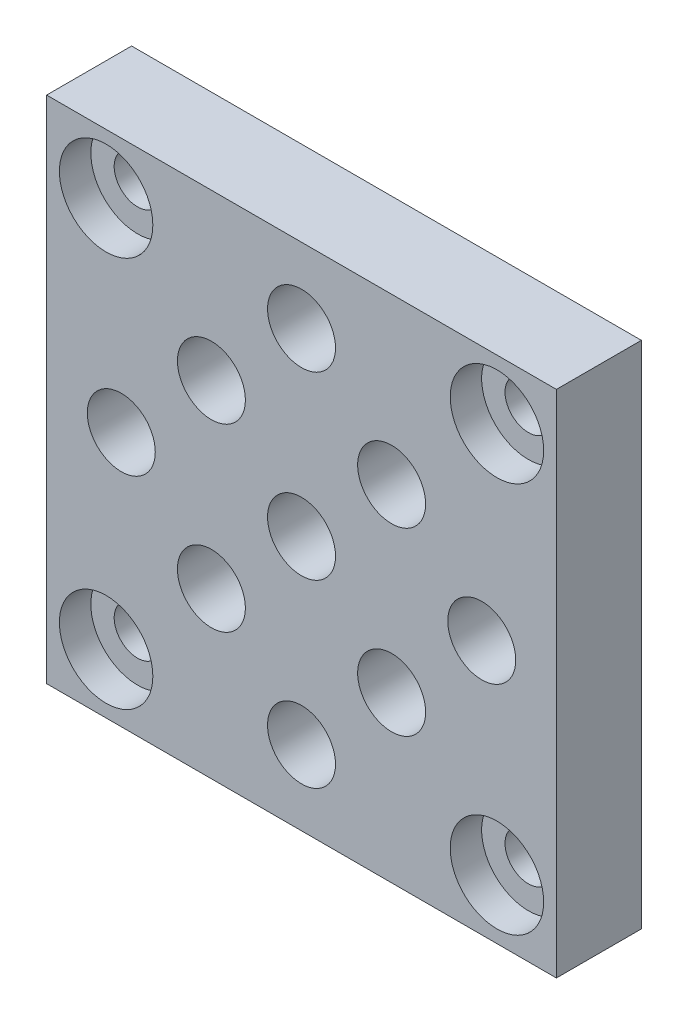
ISO-10303-21;
HEADER;
FILE_DESCRIPTION(('STEP AP214'),'2;1');
FILE_NAME('part.step','',(''),(''),'','','');
FILE_SCHEMA(('AUTOMOTIVE_DESIGN { 1 0 10303 214 1 1 1 1 }'));
ENDSEC;
DATA;
#1=APPLICATION_CONTEXT('core data for automotive mechanical design processes');
#2=APPLICATION_PROTOCOL_DEFINITION('international standard','automotive_design',2000,#1);
#3=PRODUCT_CONTEXT('',#1,'mechanical');
#4=PRODUCT('Part','Part','',(#3));
#5=PRODUCT_RELATED_PRODUCT_CATEGORY('part','',(#4));
#6=PRODUCT_DEFINITION_FORMATION('','',#4);
#7=PRODUCT_DEFINITION_CONTEXT('part definition',#1,'design');
#8=PRODUCT_DEFINITION('design','',#6,#7);
#9=PRODUCT_DEFINITION_SHAPE('','',#8);
#10=(LENGTH_UNIT() NAMED_UNIT(*) SI_UNIT(.MILLI.,.METRE.));
#11=(NAMED_UNIT(*) PLANE_ANGLE_UNIT() SI_UNIT($,.RADIAN.));
#12=(NAMED_UNIT(*) SI_UNIT($,.STERADIAN.) SOLID_ANGLE_UNIT());
#13=UNCERTAINTY_MEASURE_WITH_UNIT(LENGTH_MEASURE(1.E-05),#10,'distance_accuracy_value','');
#14=(GEOMETRIC_REPRESENTATION_CONTEXT(3) GLOBAL_UNCERTAINTY_ASSIGNED_CONTEXT((#13)) GLOBAL_UNIT_ASSIGNED_CONTEXT((#10,
#11,#12)) REPRESENTATION_CONTEXT('',''));
#15=CARTESIAN_POINT('',(0.,0.,0.));
#16=DIRECTION('',(0.,0.,1.));
#17=DIRECTION('',(1.,0.,0.));
#18=AXIS2_PLACEMENT_3D('',#15,#16,#17);
#19=CARTESIAN_POINT('',(0.,21.2132034355964,-5.));
#20=DIRECTION('',(0.,0.,1.));
#21=DIRECTION('',(1.,0.,0.));
#22=AXIS2_PLACEMENT_3D('',#19,#20,#21);
#23=CYLINDRICAL_SURFACE('',#22,4.);
#24=CARTESIAN_POINT('',(0.,21.2132034355964,-5.));
#25=DIRECTION('',(0.,0.,1.));
#26=DIRECTION('',(1.,0.,0.));
#27=AXIS2_PLACEMENT_3D('',#24,#25,#26);
#28=CIRCLE('',#27,4.);
#29=CARTESIAN_POINT('',(4.,21.2132034355964,-5.));
#30=VERTEX_POINT('',#29);
#31=EDGE_CURVE('E50',#30,#30,#28,.T.);
#32=ORIENTED_EDGE('',*,*,#31,.F.);
#33=EDGE_LOOP('',(#32));
#34=FACE_BOUND('',#33,.T.);
#35=CARTESIAN_POINT('',(0.,21.2132034355964,5.));
#36=DIRECTION('',(0.,0.,1.));
#37=DIRECTION('',(1.,0.,0.));
#38=AXIS2_PLACEMENT_3D('',#35,#36,#37);
#39=CIRCLE('',#38,4.);
#40=CARTESIAN_POINT('',(4.,21.2132034355964,5.));
#41=VERTEX_POINT('',#40);
#42=EDGE_CURVE('E11',#41,#41,#39,.T.);
#43=ORIENTED_EDGE('',*,*,#42,.T.);
#44=EDGE_LOOP('',(#43));
#45=FACE_BOUND('',#44,.T.);
#46=ADVANCED_FACE('F41',(#34,#45),#23,.F.);
#47=CARTESIAN_POINT('',(-10.6066017177982,10.6066017177982,-5.));
#48=DIRECTION('',(0.,0.,1.));
#49=DIRECTION('',(1.,0.,0.));
#50=AXIS2_PLACEMENT_3D('',#47,#48,#49);
#51=CYLINDRICAL_SURFACE('',#50,4.);
#52=CARTESIAN_POINT('',(-10.6066017177982,10.6066017177982,-5.));
#53=DIRECTION('',(0.,0.,1.));
#54=DIRECTION('',(1.,0.,0.));
#55=AXIS2_PLACEMENT_3D('',#52,#53,#54);
#56=CIRCLE('',#55,4.);
#57=CARTESIAN_POINT('',(-6.60660171779821,10.6066017177982,-5.));
#58=VERTEX_POINT('',#57);
#59=EDGE_CURVE('E172',#58,#58,#56,.T.);
#60=ORIENTED_EDGE('',*,*,#59,.F.);
#61=EDGE_LOOP('',(#60));
#62=FACE_BOUND('',#61,.T.);
#63=CARTESIAN_POINT('',(-10.6066017177982,10.6066017177982,5.));
#64=DIRECTION('',(0.,0.,1.));
#65=DIRECTION('',(1.,0.,0.));
#66=AXIS2_PLACEMENT_3D('',#63,#64,#65);
#67=CIRCLE('',#66,4.);
#68=CARTESIAN_POINT('',(-6.60660171779821,10.6066017177982,5.));
#69=VERTEX_POINT('',#68);
#70=EDGE_CURVE('E176',#69,#69,#67,.T.);
#71=ORIENTED_EDGE('',*,*,#70,.T.);
#72=EDGE_LOOP('',(#71));
#73=FACE_BOUND('',#72,.T.);
#74=ADVANCED_FACE('F188',(#62,#73),#51,.F.);
#75=CARTESIAN_POINT('',(-21.2132034355964,0.,-5.));
#76=DIRECTION('',(0.,0.,1.));
#77=DIRECTION('',(1.,0.,0.));
#78=AXIS2_PLACEMENT_3D('',#75,#76,#77);
#79=CYLINDRICAL_SURFACE('',#78,4.);
#80=CARTESIAN_POINT('',(-21.2132034355964,0.,-5.));
#81=DIRECTION('',(0.,0.,1.));
#82=DIRECTION('',(1.,0.,0.));
#83=AXIS2_PLACEMENT_3D('',#80,#81,#82);
#84=CIRCLE('',#83,4.);
#85=CARTESIAN_POINT('',(-17.2132034355964,0.,-5.));
#86=VERTEX_POINT('',#85);
#87=EDGE_CURVE('E164',#86,#86,#84,.T.);
#88=ORIENTED_EDGE('',*,*,#87,.F.);
#89=EDGE_LOOP('',(#88));
#90=FACE_BOUND('',#89,.T.);
#91=CARTESIAN_POINT('',(-21.2132034355964,0.,5.));
#92=DIRECTION('',(0.,0.,1.));
#93=DIRECTION('',(1.,0.,0.));
#94=AXIS2_PLACEMENT_3D('',#91,#92,#93);
#95=CIRCLE('',#94,4.);
#96=CARTESIAN_POINT('',(-17.2132034355964,0.,5.));
#97=VERTEX_POINT('',#96);
#98=EDGE_CURVE('E168',#97,#97,#95,.T.);
#99=ORIENTED_EDGE('',*,*,#98,.T.);
#100=EDGE_LOOP('',(#99));
#101=FACE_BOUND('',#100,.T.);
#102=ADVANCED_FACE('F232',(#90,#101),#79,.F.);
#103=CARTESIAN_POINT('',(10.6066017177982,10.6066017177982,-5.));
#104=DIRECTION('',(0.,0.,1.));
#105=DIRECTION('',(1.,0.,0.));
#106=AXIS2_PLACEMENT_3D('',#103,#104,#105);
#107=CYLINDRICAL_SURFACE('',#106,4.);
#108=CARTESIAN_POINT('',(10.6066017177982,10.6066017177982,-5.));
#109=DIRECTION('',(0.,0.,1.));
#110=DIRECTION('',(1.,0.,0.));
#111=AXIS2_PLACEMENT_3D('',#108,#109,#110);
#112=CIRCLE('',#111,4.);
#113=CARTESIAN_POINT('',(14.6066017177982,10.6066017177982,-5.));
#114=VERTEX_POINT('',#113);
#115=EDGE_CURVE('E156',#114,#114,#112,.T.);
#116=ORIENTED_EDGE('',*,*,#115,.F.);
#117=EDGE_LOOP('',(#116));
#118=FACE_BOUND('',#117,.T.);
#119=CARTESIAN_POINT('',(10.6066017177982,10.6066017177982,5.));
#120=DIRECTION('',(0.,0.,1.));
#121=DIRECTION('',(1.,0.,0.));
#122=AXIS2_PLACEMENT_3D('',#119,#120,#121);
#123=CIRCLE('',#122,4.);
#124=CARTESIAN_POINT('',(14.6066017177982,10.6066017177982,5.));
#125=VERTEX_POINT('',#124);
#126=EDGE_CURVE('E160',#125,#125,#123,.T.);
#127=ORIENTED_EDGE('',*,*,#126,.T.);
#128=EDGE_LOOP('',(#127));
#129=FACE_BOUND('',#128,.T.);
#130=ADVANCED_FACE('F228',(#118,#129),#107,.F.);
#131=CARTESIAN_POINT('',(0.,0.,-5.));
#132=DIRECTION('',(0.,0.,1.));
#133=DIRECTION('',(1.,0.,0.));
#134=AXIS2_PLACEMENT_3D('',#131,#132,#133);
#135=CYLINDRICAL_SURFACE('',#134,4.);
#136=CARTESIAN_POINT('',(0.,0.,-5.));
#137=DIRECTION('',(0.,0.,1.));
#138=DIRECTION('',(1.,0.,0.));
#139=AXIS2_PLACEMENT_3D('',#136,#137,#138);
#140=CIRCLE('',#139,4.);
#141=CARTESIAN_POINT('',(4.,0.,-5.));
#142=VERTEX_POINT('',#141);
#143=EDGE_CURVE('E148',#142,#142,#140,.T.);
#144=ORIENTED_EDGE('',*,*,#143,.F.);
#145=EDGE_LOOP('',(#144));
#146=FACE_BOUND('',#145,.T.);
#147=CARTESIAN_POINT('',(0.,0.,5.));
#148=DIRECTION('',(0.,0.,1.));
#149=DIRECTION('',(1.,0.,0.));
#150=AXIS2_PLACEMENT_3D('',#147,#148,#149);
#151=CIRCLE('',#150,4.);
#152=CARTESIAN_POINT('',(4.,0.,5.));
#153=VERTEX_POINT('',#152);
#154=EDGE_CURVE('E152',#153,#153,#151,.T.);
#155=ORIENTED_EDGE('',*,*,#154,.T.);
#156=EDGE_LOOP('',(#155));
#157=FACE_BOUND('',#156,.T.);
#158=ADVANCED_FACE('F224',(#146,#157),#135,.F.);
#159=CARTESIAN_POINT('',(-10.6066017177982,-10.6066017177982,-5.));
#160=DIRECTION('',(0.,0.,1.));
#161=DIRECTION('',(1.,0.,0.));
#162=AXIS2_PLACEMENT_3D('',#159,#160,#161);
#163=CYLINDRICAL_SURFACE('',#162,4.);
#164=CARTESIAN_POINT('',(-10.6066017177982,-10.6066017177982,-5.));
#165=DIRECTION('',(0.,0.,1.));
#166=DIRECTION('',(1.,0.,0.));
#167=AXIS2_PLACEMENT_3D('',#164,#165,#166);
#168=CIRCLE('',#167,4.);
#169=CARTESIAN_POINT('',(-6.60660171779821,-10.6066017177982,-5.));
#170=VERTEX_POINT('',#169);
#171=EDGE_CURVE('E140',#170,#170,#168,.T.);
#172=ORIENTED_EDGE('',*,*,#171,.F.);
#173=EDGE_LOOP('',(#172));
#174=FACE_BOUND('',#173,.T.);
#175=CARTESIAN_POINT('',(-10.6066017177982,-10.6066017177982,5.));
#176=DIRECTION('',(0.,0.,1.));
#177=DIRECTION('',(1.,0.,0.));
#178=AXIS2_PLACEMENT_3D('',#175,#176,#177);
#179=CIRCLE('',#178,4.);
#180=CARTESIAN_POINT('',(-6.60660171779821,-10.6066017177982,5.));
#181=VERTEX_POINT('',#180);
#182=EDGE_CURVE('E144',#181,#181,#179,.T.);
#183=ORIENTED_EDGE('',*,*,#182,.T.);
#184=EDGE_LOOP('',(#183));
#185=FACE_BOUND('',#184,.T.);
#186=ADVANCED_FACE('F220',(#174,#185),#163,.F.);
#187=CARTESIAN_POINT('',(21.2132034355964,0.,-5.));
#188=DIRECTION('',(0.,0.,1.));
#189=DIRECTION('',(1.,0.,0.));
#190=AXIS2_PLACEMENT_3D('',#187,#188,#189);
#191=CYLINDRICAL_SURFACE('',#190,4.);
#192=CARTESIAN_POINT('',(21.2132034355964,0.,-5.));
#193=DIRECTION('',(0.,0.,1.));
#194=DIRECTION('',(1.,0.,0.));
#195=AXIS2_PLACEMENT_3D('',#192,#193,#194);
#196=CIRCLE('',#195,4.);
#197=CARTESIAN_POINT('',(25.2132034355964,0.,-5.));
#198=VERTEX_POINT('',#197);
#199=EDGE_CURVE('E132',#198,#198,#196,.T.);
#200=ORIENTED_EDGE('',*,*,#199,.F.);
#201=EDGE_LOOP('',(#200));
#202=FACE_BOUND('',#201,.T.);
#203=CARTESIAN_POINT('',(21.2132034355964,0.,5.));
#204=DIRECTION('',(0.,0.,1.));
#205=DIRECTION('',(1.,0.,0.));
#206=AXIS2_PLACEMENT_3D('',#203,#204,#205);
#207=CIRCLE('',#206,4.);
#208=CARTESIAN_POINT('',(25.2132034355964,0.,5.));
#209=VERTEX_POINT('',#208);
#210=EDGE_CURVE('E136',#209,#209,#207,.T.);
#211=ORIENTED_EDGE('',*,*,#210,.T.);
#212=EDGE_LOOP('',(#211));
#213=FACE_BOUND('',#212,.T.);
#214=ADVANCED_FACE('F216',(#202,#213),#191,.F.);
#215=CARTESIAN_POINT('',(30.,30.,5.));
#216=DIRECTION('',(0.,-1.,0.));
#217=DIRECTION('',(0.,0.,-1.));
#218=AXIS2_PLACEMENT_3D('',#215,#216,#217);
#219=PLANE('',#218);
#220=DIRECTION('',(-1.,0.,0.));
#221=VECTOR('',#220,1.);
#222=CARTESIAN_POINT('',(30.,30.,-5.));
#223=LINE('',#222,#221);
#224=CARTESIAN_POINT('',(30.,30.,-5.));
#225=VERTEX_POINT('',#224);
#226=CARTESIAN_POINT('',(-30.,30.,-5.));
#227=VERTEX_POINT('',#226);
#228=EDGE_CURVE('E115',#225,#227,#223,.T.);
#229=ORIENTED_EDGE('',*,*,#228,.T.);
#230=DIRECTION('',(0.,0.,-1.));
#231=VECTOR('',#230,1.);
#232=CARTESIAN_POINT('',(-30.,30.,5.));
#233=LINE('',#232,#231);
#234=CARTESIAN_POINT('',(-30.,30.,5.));
#235=VERTEX_POINT('',#234);
#236=EDGE_CURVE('E103',#235,#227,#233,.T.);
#237=ORIENTED_EDGE('',*,*,#236,.F.);
#238=DIRECTION('',(-1.,0.,0.));
#239=VECTOR('',#238,1.);
#240=CARTESIAN_POINT('',(30.,30.,5.));
#241=LINE('',#240,#239);
#242=CARTESIAN_POINT('',(30.,30.,5.));
#243=VERTEX_POINT('',#242);
#244=EDGE_CURVE('E95',#243,#235,#241,.T.);
#245=ORIENTED_EDGE('',*,*,#244,.F.);
#246=DIRECTION('',(0.,0.,-1.));
#247=VECTOR('',#246,1.);
#248=CARTESIAN_POINT('',(30.,30.,5.));
#249=LINE('',#248,#247);
#250=EDGE_CURVE('E111',#243,#225,#249,.T.);
#251=ORIENTED_EDGE('',*,*,#250,.T.);
#252=EDGE_LOOP('',(#229,#237,#245,#251));
#253=FACE_BOUND('',#252,.T.);
#254=ADVANCED_FACE('F213',(#253),#219,.F.);
#255=CARTESIAN_POINT('',(-30.,-30.,5.));
#256=DIRECTION('',(1.,0.,0.));
#257=DIRECTION('',(0.,0.,-1.));
#258=AXIS2_PLACEMENT_3D('',#255,#256,#257);
#259=PLANE('',#258);
#260=DIRECTION('',(0.,-1.,0.));
#261=VECTOR('',#260,1.);
#262=CARTESIAN_POINT('',(-30.,-30.,-5.));
#263=LINE('',#262,#261);
#264=CARTESIAN_POINT('',(-30.,-30.,-5.));
#265=VERTEX_POINT('',#264);
#266=EDGE_CURVE('E101',#227,#265,#263,.T.);
#267=ORIENTED_EDGE('',*,*,#266,.T.);
#268=DIRECTION('',(0.,0.,-1.));
#269=VECTOR('',#268,1.);
#270=CARTESIAN_POINT('',(-30.,-30.,5.));
#271=LINE('',#270,#269);
#272=CARTESIAN_POINT('',(-30.,-30.,5.));
#273=VERTEX_POINT('',#272);
#274=EDGE_CURVE('E99',#273,#265,#271,.T.);
#275=ORIENTED_EDGE('',*,*,#274,.F.);
#276=DIRECTION('',(0.,-1.,0.));
#277=VECTOR('',#276,1.);
#278=CARTESIAN_POINT('',(-30.,-30.,5.));
#279=LINE('',#278,#277);
#280=EDGE_CURVE('E89',#235,#273,#279,.T.);
#281=ORIENTED_EDGE('',*,*,#280,.F.);
#282=ORIENTED_EDGE('',*,*,#236,.T.);
#283=EDGE_LOOP('',(#267,#275,#281,#282));
#284=FACE_BOUND('',#283,.T.);
#285=ADVANCED_FACE('F100',(#284),#259,.F.);
#286=CARTESIAN_POINT('',(30.,-30.,5.));
#287=DIRECTION('',(0.,1.,0.));
#288=DIRECTION('',(0.,0.,1.));
#289=AXIS2_PLACEMENT_3D('',#286,#287,#288);
#290=PLANE('',#289);
#291=DIRECTION('',(1.,0.,0.));
#292=VECTOR('',#291,1.);
#293=CARTESIAN_POINT('',(30.,-30.,-5.));
#294=LINE('',#293,#292);
#295=CARTESIAN_POINT('',(30.,-30.,-5.));
#296=VERTEX_POINT('',#295);
#297=EDGE_CURVE('E75',#265,#296,#294,.T.);
#298=ORIENTED_EDGE('',*,*,#297,.T.);
#299=DIRECTION('',(0.,0.,-1.));
#300=VECTOR('',#299,1.);
#301=CARTESIAN_POINT('',(30.,-30.,5.));
#302=LINE('',#301,#300);
#303=CARTESIAN_POINT('',(30.,-30.,5.));
#304=VERTEX_POINT('',#303);
#305=EDGE_CURVE('E104',#304,#296,#302,.T.);
#306=ORIENTED_EDGE('',*,*,#305,.F.);
#307=DIRECTION('',(1.,0.,0.));
#308=VECTOR('',#307,1.);
#309=CARTESIAN_POINT('',(30.,-30.,5.));
#310=LINE('',#309,#308);
#311=EDGE_CURVE('E93',#273,#304,#310,.T.);
#312=ORIENTED_EDGE('',*,*,#311,.F.);
#313=ORIENTED_EDGE('',*,*,#274,.T.);
#314=EDGE_LOOP('',(#298,#306,#312,#313));
#315=FACE_BOUND('',#314,.T.);
#316=ADVANCED_FACE('F106',(#315),#290,.F.);
#317=CARTESIAN_POINT('',(30.,-30.,5.));
#318=DIRECTION('',(-1.,0.,0.));
#319=DIRECTION('',(0.,0.,1.));
#320=AXIS2_PLACEMENT_3D('',#317,#318,#319);
#321=PLANE('',#320);
#322=DIRECTION('',(0.,1.,0.));
#323=VECTOR('',#322,1.);
#324=CARTESIAN_POINT('',(30.,-30.,-5.));
#325=LINE('',#324,#323);
#326=EDGE_CURVE('E81',#296,#225,#325,.T.);
#327=ORIENTED_EDGE('',*,*,#326,.T.);
#328=ORIENTED_EDGE('',*,*,#250,.F.);
#329=DIRECTION('',(0.,1.,0.));
#330=VECTOR('',#329,1.);
#331=CARTESIAN_POINT('',(30.,-30.,5.));
#332=LINE('',#331,#330);
#333=EDGE_CURVE('E58',#304,#243,#332,.T.);
#334=ORIENTED_EDGE('',*,*,#333,.F.);
#335=ORIENTED_EDGE('',*,*,#305,.T.);
#336=EDGE_LOOP('',(#327,#328,#334,#335));
#337=FACE_BOUND('',#336,.T.);
#338=ADVANCED_FACE('F192',(#337),#321,.F.);
#339=CARTESIAN_POINT('',(0.,0.,5.));
#340=DIRECTION('',(0.,0.,-1.));
#341=DIRECTION('',(-1.,0.,0.));
#342=AXIS2_PLACEMENT_3D('',#339,#340,#341);
#343=PLANE('',#342);
#344=CARTESIAN_POINT('',(-23.,23.,5.));
#345=DIRECTION('',(0.,0.,1.));
#346=DIRECTION('',(1.,0.,0.));
#347=AXIS2_PLACEMENT_3D('',#344,#345,#346);
#348=CIRCLE('',#347,5.5);
#349=CARTESIAN_POINT('',(-17.5,23.,5.));
#350=VERTEX_POINT('',#349);
#351=EDGE_CURVE('E411',#350,#350,#348,.T.);
#352=ORIENTED_EDGE('',*,*,#351,.F.);
#353=EDGE_LOOP('',(#352));
#354=FACE_BOUND('',#353,.T.);
#355=CARTESIAN_POINT('',(23.,23.,5.));
#356=DIRECTION('',(0.,0.,1.));
#357=DIRECTION('',(1.,0.,0.));
#358=AXIS2_PLACEMENT_3D('',#355,#356,#357);
#359=CIRCLE('',#358,5.5);
#360=CARTESIAN_POINT('',(28.5,23.,5.));
#361=VERTEX_POINT('',#360);
#362=EDGE_CURVE('E426',#361,#361,#359,.T.);
#363=ORIENTED_EDGE('',*,*,#362,.F.);
#364=EDGE_LOOP('',(#363));
#365=FACE_BOUND('',#364,.T.);
#366=CARTESIAN_POINT('',(23.,-23.,5.));
#367=DIRECTION('',(0.,0.,1.));
#368=DIRECTION('',(1.,0.,0.));
#369=AXIS2_PLACEMENT_3D('',#366,#367,#368);
#370=CIRCLE('',#369,5.5);
#371=CARTESIAN_POINT('',(28.5,-23.,5.));
#372=VERTEX_POINT('',#371);
#373=EDGE_CURVE('E442',#372,#372,#370,.T.);
#374=ORIENTED_EDGE('',*,*,#373,.F.);
#375=EDGE_LOOP('',(#374));
#376=FACE_BOUND('',#375,.T.);
#377=CARTESIAN_POINT('',(-23.,-23.,5.));
#378=DIRECTION('',(0.,0.,1.));
#379=DIRECTION('',(1.,0.,0.));
#380=AXIS2_PLACEMENT_3D('',#377,#378,#379);
#381=CIRCLE('',#380,5.5);
#382=CARTESIAN_POINT('',(-17.5,-23.,5.));
#383=VERTEX_POINT('',#382);
#384=EDGE_CURVE('E458',#383,#383,#381,.T.);
#385=ORIENTED_EDGE('',*,*,#384,.F.);
#386=EDGE_LOOP('',(#385));
#387=FACE_BOUND('',#386,.T.);
#388=CARTESIAN_POINT('',(10.6066017177982,-10.6066017177982,5.));
#389=DIRECTION('',(0.,0.,1.));
#390=DIRECTION('',(1.,0.,0.));
#391=AXIS2_PLACEMENT_3D('',#388,#389,#390);
#392=CIRCLE('',#391,4.);
#393=CARTESIAN_POINT('',(14.6066017177982,-10.6066017177982,5.));
#394=VERTEX_POINT('',#393);
#395=EDGE_CURVE('E478',#394,#394,#392,.T.);
#396=ORIENTED_EDGE('',*,*,#395,.F.);
#397=EDGE_LOOP('',(#396));
#398=FACE_BOUND('',#397,.T.);
#399=CARTESIAN_POINT('',(0.,-21.2132034355964,5.));
#400=DIRECTION('',(0.,0.,1.));
#401=DIRECTION('',(1.,0.,0.));
#402=AXIS2_PLACEMENT_3D('',#399,#400,#401);
#403=CIRCLE('',#402,4.);
#404=CARTESIAN_POINT('',(4.,-21.2132034355964,5.));
#405=VERTEX_POINT('',#404);
#406=EDGE_CURVE('E482',#405,#405,#403,.T.);
#407=ORIENTED_EDGE('',*,*,#406,.F.);
#408=EDGE_LOOP('',(#407));
#409=FACE_BOUND('',#408,.T.);
#410=ORIENTED_EDGE('',*,*,#244,.T.);
#411=ORIENTED_EDGE('',*,*,#280,.T.);
#412=ORIENTED_EDGE('',*,*,#311,.T.);
#413=ORIENTED_EDGE('',*,*,#333,.T.);
#414=EDGE_LOOP('',(#410,#411,#412,#413));
#415=FACE_BOUND('',#414,.T.);
#416=ORIENTED_EDGE('',*,*,#210,.F.);
#417=EDGE_LOOP('',(#416));
#418=FACE_BOUND('',#417,.T.);
#419=ORIENTED_EDGE('',*,*,#182,.F.);
#420=EDGE_LOOP('',(#419));
#421=FACE_BOUND('',#420,.T.);
#422=ORIENTED_EDGE('',*,*,#154,.F.);
#423=EDGE_LOOP('',(#422));
#424=FACE_BOUND('',#423,.T.);
#425=ORIENTED_EDGE('',*,*,#126,.F.);
#426=EDGE_LOOP('',(#425));
#427=FACE_BOUND('',#426,.T.);
#428=ORIENTED_EDGE('',*,*,#98,.F.);
#429=EDGE_LOOP('',(#428));
#430=FACE_BOUND('',#429,.T.);
#431=ORIENTED_EDGE('',*,*,#70,.F.);
#432=EDGE_LOOP('',(#431));
#433=FACE_BOUND('',#432,.T.);
#434=ORIENTED_EDGE('',*,*,#42,.F.);
#435=EDGE_LOOP('',(#434));
#436=FACE_BOUND('',#435,.T.);
#437=ADVANCED_FACE('F90',(#354,#365,#376,#387,#398,#409,#415,#418,#421,#424,#427,#430,#433,
#436),#343,.F.);
#438=CARTESIAN_POINT('',(0.,0.,-5.));
#439=DIRECTION('',(0.,0.,-1.));
#440=DIRECTION('',(-1.,0.,0.));
#441=AXIS2_PLACEMENT_3D('',#438,#439,#440);
#442=PLANE('',#441);
#443=CARTESIAN_POINT('',(-23.,23.,-5.));
#444=DIRECTION('',(0.,0.,1.));
#445=DIRECTION('',(1.,0.,0.));
#446=AXIS2_PLACEMENT_3D('',#443,#444,#445);
#447=CIRCLE('',#446,2.75);
#448=CARTESIAN_POINT('',(-20.25,23.,-5.));
#449=VERTEX_POINT('',#448);
#450=EDGE_CURVE('E422',#449,#449,#447,.T.);
#451=ORIENTED_EDGE('',*,*,#450,.T.);
#452=EDGE_LOOP('',(#451));
#453=FACE_BOUND('',#452,.T.);
#454=CARTESIAN_POINT('',(23.,23.,-5.));
#455=DIRECTION('',(0.,0.,1.));
#456=DIRECTION('',(1.,0.,0.));
#457=AXIS2_PLACEMENT_3D('',#454,#455,#456);
#458=CIRCLE('',#457,2.75);
#459=CARTESIAN_POINT('',(25.75,23.,-5.));
#460=VERTEX_POINT('',#459);
#461=EDGE_CURVE('E438',#460,#460,#458,.T.);
#462=ORIENTED_EDGE('',*,*,#461,.T.);
#463=EDGE_LOOP('',(#462));
#464=FACE_BOUND('',#463,.T.);
#465=CARTESIAN_POINT('',(23.,-23.,-5.));
#466=DIRECTION('',(0.,0.,1.));
#467=DIRECTION('',(1.,0.,0.));
#468=AXIS2_PLACEMENT_3D('',#465,#466,#467);
#469=CIRCLE('',#468,2.75);
#470=CARTESIAN_POINT('',(25.75,-23.,-5.));
#471=VERTEX_POINT('',#470);
#472=EDGE_CURVE('E454',#471,#471,#469,.T.);
#473=ORIENTED_EDGE('',*,*,#472,.T.);
#474=EDGE_LOOP('',(#473));
#475=FACE_BOUND('',#474,.T.);
#476=CARTESIAN_POINT('',(-23.,-23.,-5.));
#477=DIRECTION('',(0.,0.,1.));
#478=DIRECTION('',(1.,0.,0.));
#479=AXIS2_PLACEMENT_3D('',#476,#477,#478);
#480=CIRCLE('',#479,2.75);
#481=CARTESIAN_POINT('',(-20.25,-23.,-5.));
#482=VERTEX_POINT('',#481);
#483=EDGE_CURVE('E470',#482,#482,#480,.T.);
#484=ORIENTED_EDGE('',*,*,#483,.T.);
#485=EDGE_LOOP('',(#484));
#486=FACE_BOUND('',#485,.T.);
#487=CARTESIAN_POINT('',(10.6066017177982,-10.6066017177982,-5.));
#488=DIRECTION('',(0.,0.,1.));
#489=DIRECTION('',(1.,0.,0.));
#490=AXIS2_PLACEMENT_3D('',#487,#488,#489);
#491=CIRCLE('',#490,4.);
#492=CARTESIAN_POINT('',(14.6066017177982,-10.6066017177982,-5.));
#493=VERTEX_POINT('',#492);
#494=EDGE_CURVE('E474',#493,#493,#491,.T.);
#495=ORIENTED_EDGE('',*,*,#494,.T.);
#496=EDGE_LOOP('',(#495));
#497=FACE_BOUND('',#496,.T.);
#498=CARTESIAN_POINT('',(0.,-21.2132034355964,-5.));
#499=DIRECTION('',(0.,0.,1.));
#500=DIRECTION('',(1.,0.,0.));
#501=AXIS2_PLACEMENT_3D('',#498,#499,#500);
#502=CIRCLE('',#501,4.);
#503=CARTESIAN_POINT('',(4.,-21.2132034355964,-5.));
#504=VERTEX_POINT('',#503);
#505=EDGE_CURVE('E119',#504,#504,#502,.T.);
#506=ORIENTED_EDGE('',*,*,#505,.T.);
#507=EDGE_LOOP('',(#506));
#508=FACE_BOUND('',#507,.T.);
#509=ORIENTED_EDGE('',*,*,#228,.F.);
#510=ORIENTED_EDGE('',*,*,#326,.F.);
#511=ORIENTED_EDGE('',*,*,#297,.F.);
#512=ORIENTED_EDGE('',*,*,#266,.F.);
#513=EDGE_LOOP('',(#509,#510,#511,#512));
#514=FACE_BOUND('',#513,.T.);
#515=ORIENTED_EDGE('',*,*,#199,.T.);
#516=EDGE_LOOP('',(#515));
#517=FACE_BOUND('',#516,.T.);
#518=ORIENTED_EDGE('',*,*,#171,.T.);
#519=EDGE_LOOP('',(#518));
#520=FACE_BOUND('',#519,.T.);
#521=ORIENTED_EDGE('',*,*,#143,.T.);
#522=EDGE_LOOP('',(#521));
#523=FACE_BOUND('',#522,.T.);
#524=ORIENTED_EDGE('',*,*,#115,.T.);
#525=EDGE_LOOP('',(#524));
#526=FACE_BOUND('',#525,.T.);
#527=ORIENTED_EDGE('',*,*,#87,.T.);
#528=EDGE_LOOP('',(#527));
#529=FACE_BOUND('',#528,.T.);
#530=ORIENTED_EDGE('',*,*,#59,.T.);
#531=EDGE_LOOP('',(#530));
#532=FACE_BOUND('',#531,.T.);
#533=ORIENTED_EDGE('',*,*,#31,.T.);
#534=EDGE_LOOP('',(#533));
#535=FACE_BOUND('',#534,.T.);
#536=ADVANCED_FACE('F184',(#453,#464,#475,#486,#497,#508,#514,#517,#520,#523,#526,#529,#532,
#535),#442,.T.);
#537=CARTESIAN_POINT('',(0.,-21.2132034355964,-5.));
#538=DIRECTION('',(0.,0.,1.));
#539=DIRECTION('',(1.,0.,0.));
#540=AXIS2_PLACEMENT_3D('',#537,#538,#539);
#541=CYLINDRICAL_SURFACE('',#540,4.);
#542=ORIENTED_EDGE('',*,*,#505,.F.);
#543=EDGE_LOOP('',(#542));
#544=FACE_BOUND('',#543,.T.);
#545=ORIENTED_EDGE('',*,*,#406,.T.);
#546=EDGE_LOOP('',(#545));
#547=FACE_BOUND('',#546,.T.);
#548=ADVANCED_FACE('F199',(#544,#547),#541,.F.);
#549=CARTESIAN_POINT('',(10.6066017177982,-10.6066017177982,-5.));
#550=DIRECTION('',(0.,0.,1.));
#551=DIRECTION('',(1.,0.,0.));
#552=AXIS2_PLACEMENT_3D('',#549,#550,#551);
#553=CYLINDRICAL_SURFACE('',#552,4.);
#554=ORIENTED_EDGE('',*,*,#494,.F.);
#555=EDGE_LOOP('',(#554));
#556=FACE_BOUND('',#555,.T.);
#557=ORIENTED_EDGE('',*,*,#395,.T.);
#558=EDGE_LOOP('',(#557));
#559=FACE_BOUND('',#558,.T.);
#560=ADVANCED_FACE('F277',(#556,#559),#553,.F.);
#561=CARTESIAN_POINT('',(-23.,-23.,5.));
#562=DIRECTION('',(0.,0.,1.));
#563=DIRECTION('',(1.,0.,0.));
#564=AXIS2_PLACEMENT_3D('',#561,#562,#563);
#565=CYLINDRICAL_SURFACE('',#564,2.75);
#566=ORIENTED_EDGE('',*,*,#483,.F.);
#567=EDGE_LOOP('',(#566));
#568=FACE_BOUND('',#567,.T.);
#569=CARTESIAN_POINT('',(-23.,-23.,1.3));
#570=DIRECTION('',(0.,0.,1.));
#571=DIRECTION('',(1.,0.,0.));
#572=AXIS2_PLACEMENT_3D('',#569,#570,#571);
#573=CIRCLE('',#572,2.75);
#574=CARTESIAN_POINT('',(-20.25,-23.,1.3));
#575=VERTEX_POINT('',#574);
#576=EDGE_CURVE('E466',#575,#575,#573,.T.);
#577=ORIENTED_EDGE('',*,*,#576,.T.);
#578=EDGE_LOOP('',(#577));
#579=FACE_BOUND('',#578,.T.);
#580=ADVANCED_FACE('F279',(#568,#579),#565,.F.);
#581=CARTESIAN_POINT('',(-20.25,-23.,1.3));
#582=DIRECTION('',(0.,0.,-1.));
#583=DIRECTION('',(-1.,0.,0.));
#584=AXIS2_PLACEMENT_3D('',#581,#582,#583);
#585=PLANE('',#584);
#586=ORIENTED_EDGE('',*,*,#576,.F.);
#587=EDGE_LOOP('',(#586));
#588=FACE_BOUND('',#587,.T.);
#589=CARTESIAN_POINT('',(-23.,-23.,1.3));
#590=DIRECTION('',(0.,0.,1.));
#591=DIRECTION('',(1.,0.,0.));
#592=AXIS2_PLACEMENT_3D('',#589,#590,#591);
#593=CIRCLE('',#592,5.5);
#594=CARTESIAN_POINT('',(-17.5,-23.,1.3));
#595=VERTEX_POINT('',#594);
#596=EDGE_CURVE('E462',#595,#595,#593,.T.);
#597=ORIENTED_EDGE('',*,*,#596,.T.);
#598=EDGE_LOOP('',(#597));
#599=FACE_BOUND('',#598,.T.);
#600=ADVANCED_FACE('F292',(#588,#599),#585,.F.);
#601=CARTESIAN_POINT('',(-23.,-23.,5.));
#602=DIRECTION('',(0.,0.,1.));
#603=DIRECTION('',(1.,0.,0.));
#604=AXIS2_PLACEMENT_3D('',#601,#602,#603);
#605=CYLINDRICAL_SURFACE('',#604,5.5);
#606=ORIENTED_EDGE('',*,*,#596,.F.);
#607=EDGE_LOOP('',(#606));
#608=FACE_BOUND('',#607,.T.);
#609=ORIENTED_EDGE('',*,*,#384,.T.);
#610=EDGE_LOOP('',(#609));
#611=FACE_BOUND('',#610,.T.);
#612=ADVANCED_FACE('F303',(#608,#611),#605,.F.);
#613=CARTESIAN_POINT('',(23.,-23.,5.));
#614=DIRECTION('',(0.,0.,1.));
#615=DIRECTION('',(1.,0.,0.));
#616=AXIS2_PLACEMENT_3D('',#613,#614,#615);
#617=CYLINDRICAL_SURFACE('',#616,2.75);
#618=ORIENTED_EDGE('',*,*,#472,.F.);
#619=EDGE_LOOP('',(#618));
#620=FACE_BOUND('',#619,.T.);
#621=CARTESIAN_POINT('',(23.,-23.,1.3));
#622=DIRECTION('',(0.,0.,1.));
#623=DIRECTION('',(1.,0.,0.));
#624=AXIS2_PLACEMENT_3D('',#621,#622,#623);
#625=CIRCLE('',#624,2.75);
#626=CARTESIAN_POINT('',(25.75,-23.,1.3));
#627=VERTEX_POINT('',#626);
#628=EDGE_CURVE('E450',#627,#627,#625,.T.);
#629=ORIENTED_EDGE('',*,*,#628,.T.);
#630=EDGE_LOOP('',(#629));
#631=FACE_BOUND('',#630,.T.);
#632=ADVANCED_FACE('F313',(#620,#631),#617,.F.);
#633=CARTESIAN_POINT('',(25.75,-23.,1.3));
#634=DIRECTION('',(0.,0.,-1.));
#635=DIRECTION('',(-1.,0.,0.));
#636=AXIS2_PLACEMENT_3D('',#633,#634,#635);
#637=PLANE('',#636);
#638=ORIENTED_EDGE('',*,*,#628,.F.);
#639=EDGE_LOOP('',(#638));
#640=FACE_BOUND('',#639,.T.);
#641=CARTESIAN_POINT('',(23.,-23.,1.3));
#642=DIRECTION('',(0.,0.,1.));
#643=DIRECTION('',(1.,0.,0.));
#644=AXIS2_PLACEMENT_3D('',#641,#642,#643);
#645=CIRCLE('',#644,5.5);
#646=CARTESIAN_POINT('',(28.5,-23.,1.3));
#647=VERTEX_POINT('',#646);
#648=EDGE_CURVE('E446',#647,#647,#645,.T.);
#649=ORIENTED_EDGE('',*,*,#648,.T.);
#650=EDGE_LOOP('',(#649));
#651=FACE_BOUND('',#650,.T.);
#652=ADVANCED_FACE('F323',(#640,#651),#637,.F.);
#653=CARTESIAN_POINT('',(23.,-23.,5.));
#654=DIRECTION('',(0.,0.,1.));
#655=DIRECTION('',(1.,0.,0.));
#656=AXIS2_PLACEMENT_3D('',#653,#654,#655);
#657=CYLINDRICAL_SURFACE('',#656,5.5);
#658=ORIENTED_EDGE('',*,*,#648,.F.);
#659=EDGE_LOOP('',(#658));
#660=FACE_BOUND('',#659,.T.);
#661=ORIENTED_EDGE('',*,*,#373,.T.);
#662=EDGE_LOOP('',(#661));
#663=FACE_BOUND('',#662,.T.);
#664=ADVANCED_FACE('F333',(#660,#663),#657,.F.);
#665=CARTESIAN_POINT('',(23.,23.,5.));
#666=DIRECTION('',(0.,0.,1.));
#667=DIRECTION('',(1.,0.,0.));
#668=AXIS2_PLACEMENT_3D('',#665,#666,#667);
#669=CYLINDRICAL_SURFACE('',#668,2.75);
#670=ORIENTED_EDGE('',*,*,#461,.F.);
#671=EDGE_LOOP('',(#670));
#672=FACE_BOUND('',#671,.T.);
#673=CARTESIAN_POINT('',(23.,23.,1.3));
#674=DIRECTION('',(0.,0.,1.));
#675=DIRECTION('',(1.,0.,0.));
#676=AXIS2_PLACEMENT_3D('',#673,#674,#675);
#677=CIRCLE('',#676,2.75);
#678=CARTESIAN_POINT('',(25.75,23.,1.3));
#679=VERTEX_POINT('',#678);
#680=EDGE_CURVE('E434',#679,#679,#677,.T.);
#681=ORIENTED_EDGE('',*,*,#680,.T.);
#682=EDGE_LOOP('',(#681));
#683=FACE_BOUND('',#682,.T.);
#684=ADVANCED_FACE('F343',(#672,#683),#669,.F.);
#685=CARTESIAN_POINT('',(25.75,23.,1.3));
#686=DIRECTION('',(0.,0.,-1.));
#687=DIRECTION('',(-1.,0.,0.));
#688=AXIS2_PLACEMENT_3D('',#685,#686,#687);
#689=PLANE('',#688);
#690=ORIENTED_EDGE('',*,*,#680,.F.);
#691=EDGE_LOOP('',(#690));
#692=FACE_BOUND('',#691,.T.);
#693=CARTESIAN_POINT('',(23.,23.,1.3));
#694=DIRECTION('',(0.,0.,1.));
#695=DIRECTION('',(1.,0.,0.));
#696=AXIS2_PLACEMENT_3D('',#693,#694,#695);
#697=CIRCLE('',#696,5.5);
#698=CARTESIAN_POINT('',(28.5,23.,1.3));
#699=VERTEX_POINT('',#698);
#700=EDGE_CURVE('E430',#699,#699,#697,.T.);
#701=ORIENTED_EDGE('',*,*,#700,.T.);
#702=EDGE_LOOP('',(#701));
#703=FACE_BOUND('',#702,.T.);
#704=ADVANCED_FACE('F353',(#692,#703),#689,.F.);
#705=CARTESIAN_POINT('',(23.,23.,5.));
#706=DIRECTION('',(0.,0.,1.));
#707=DIRECTION('',(1.,0.,0.));
#708=AXIS2_PLACEMENT_3D('',#705,#706,#707);
#709=CYLINDRICAL_SURFACE('',#708,5.5);
#710=ORIENTED_EDGE('',*,*,#700,.F.);
#711=EDGE_LOOP('',(#710));
#712=FACE_BOUND('',#711,.T.);
#713=ORIENTED_EDGE('',*,*,#362,.T.);
#714=EDGE_LOOP('',(#713));
#715=FACE_BOUND('',#714,.T.);
#716=ADVANCED_FACE('F363',(#712,#715),#709,.F.);
#717=CARTESIAN_POINT('',(-23.,23.,5.));
#718=DIRECTION('',(0.,0.,1.));
#719=DIRECTION('',(1.,0.,0.));
#720=AXIS2_PLACEMENT_3D('',#717,#718,#719);
#721=CYLINDRICAL_SURFACE('',#720,2.75);
#722=ORIENTED_EDGE('',*,*,#450,.F.);
#723=EDGE_LOOP('',(#722));
#724=FACE_BOUND('',#723,.T.);
#725=CARTESIAN_POINT('',(-23.,23.,1.3));
#726=DIRECTION('',(0.,0.,1.));
#727=DIRECTION('',(1.,0.,0.));
#728=AXIS2_PLACEMENT_3D('',#725,#726,#727);
#729=CIRCLE('',#728,2.75);
#730=CARTESIAN_POINT('',(-20.25,23.,1.3));
#731=VERTEX_POINT('',#730);
#732=EDGE_CURVE('E416',#731,#731,#729,.T.);
#733=ORIENTED_EDGE('',*,*,#732,.T.);
#734=EDGE_LOOP('',(#733));
#735=FACE_BOUND('',#734,.T.);
#736=ADVANCED_FACE('F373',(#724,#735),#721,.F.);
#737=CARTESIAN_POINT('',(-20.25,23.,1.3));
#738=DIRECTION('',(0.,0.,-1.));
#739=DIRECTION('',(-1.,0.,0.));
#740=AXIS2_PLACEMENT_3D('',#737,#738,#739);
#741=PLANE('',#740);
#742=ORIENTED_EDGE('',*,*,#732,.F.);
#743=EDGE_LOOP('',(#742));
#744=FACE_BOUND('',#743,.T.);
#745=CARTESIAN_POINT('',(-23.,23.,1.3));
#746=DIRECTION('',(0.,0.,1.));
#747=DIRECTION('',(1.,0.,0.));
#748=AXIS2_PLACEMENT_3D('',#745,#746,#747);
#749=CIRCLE('',#748,5.5);
#750=CARTESIAN_POINT('',(-17.5,23.,1.3));
#751=VERTEX_POINT('',#750);
#752=EDGE_CURVE('E409',#751,#751,#749,.T.);
#753=ORIENTED_EDGE('',*,*,#752,.T.);
#754=EDGE_LOOP('',(#753));
#755=FACE_BOUND('',#754,.T.);
#756=ADVANCED_FACE('F383',(#744,#755),#741,.F.);
#757=CARTESIAN_POINT('',(-23.,23.,5.));
#758=DIRECTION('',(0.,0.,1.));
#759=DIRECTION('',(1.,0.,0.));
#760=AXIS2_PLACEMENT_3D('',#757,#758,#759);
#761=CYLINDRICAL_SURFACE('',#760,5.5);
#762=ORIENTED_EDGE('',*,*,#752,.F.);
#763=EDGE_LOOP('',(#762));
#764=FACE_BOUND('',#763,.T.);
#765=ORIENTED_EDGE('',*,*,#351,.T.);
#766=EDGE_LOOP('',(#765));
#767=FACE_BOUND('',#766,.T.);
#768=ADVANCED_FACE('F393',(#764,#767),#761,.F.);
#769=CLOSED_SHELL('',(#46,#74,#102,#130,#158,#186,#214,#254,#285,#316,#338,#437,#536,#548,#560,
#580,#600,#612,#632,#652,#664,#684,#704,#716,#736,#756,#768));
#770=MANIFOLD_SOLID_BREP('B2',#769);
#771=ADVANCED_BREP_SHAPE_REPRESENTATION('',(#18,#770),#14);
#772=SHAPE_DEFINITION_REPRESENTATION(#9,#771);
ENDSEC;
END-ISO-10303-21;
